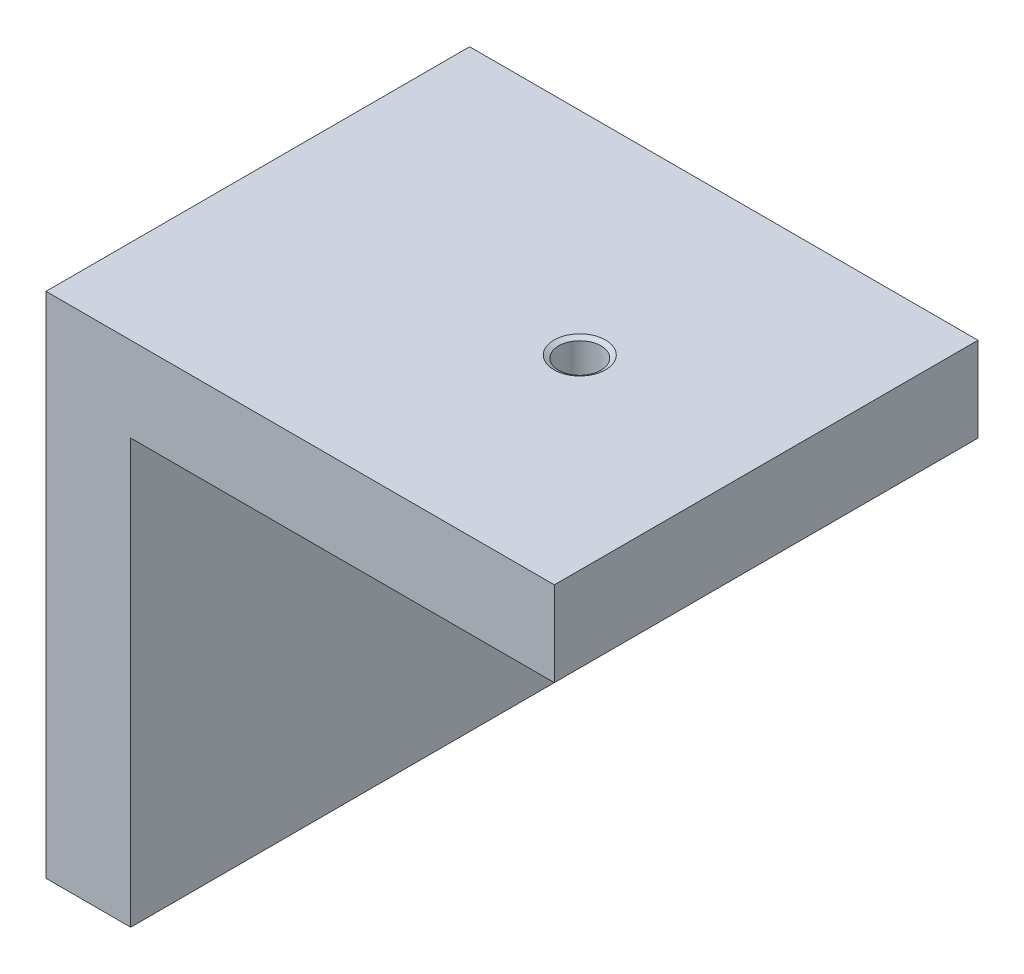
ISO-10303-21;
HEADER;
FILE_DESCRIPTION(('STEP AP214'),'2;1');
FILE_NAME('part.step','',(''),(''),'','','');
FILE_SCHEMA(('AUTOMOTIVE_DESIGN { 1 0 10303 214 1 1 1 1 }'));
ENDSEC;
DATA;
#1=APPLICATION_CONTEXT('core data for automotive mechanical design processes');
#2=APPLICATION_PROTOCOL_DEFINITION('international standard','automotive_design',2000,#1);
#3=PRODUCT_CONTEXT('',#1,'mechanical');
#4=PRODUCT('Part','Part','',(#3));
#5=PRODUCT_RELATED_PRODUCT_CATEGORY('part','',(#4));
#6=PRODUCT_DEFINITION_FORMATION('','',#4);
#7=PRODUCT_DEFINITION_CONTEXT('part definition',#1,'design');
#8=PRODUCT_DEFINITION('design','',#6,#7);
#9=PRODUCT_DEFINITION_SHAPE('','',#8);
#10=(LENGTH_UNIT() NAMED_UNIT(*) SI_UNIT(.MILLI.,.METRE.));
#11=(NAMED_UNIT(*) PLANE_ANGLE_UNIT() SI_UNIT($,.RADIAN.));
#12=(NAMED_UNIT(*) SI_UNIT($,.STERADIAN.) SOLID_ANGLE_UNIT());
#13=UNCERTAINTY_MEASURE_WITH_UNIT(LENGTH_MEASURE(1.E-05),#10,'distance_accuracy_value','');
#14=(GEOMETRIC_REPRESENTATION_CONTEXT(3) GLOBAL_UNCERTAINTY_ASSIGNED_CONTEXT((#13)) GLOBAL_UNIT_ASSIGNED_CONTEXT((#10,
#11,#12)) REPRESENTATION_CONTEXT('',''));
#15=CARTESIAN_POINT('',(0.,0.,0.));
#16=DIRECTION('',(0.,0.,1.));
#17=DIRECTION('',(1.,0.,0.));
#18=AXIS2_PLACEMENT_3D('',#15,#16,#17);
#19=CARTESIAN_POINT('',(5.,0.,25.));
#20=DIRECTION('',(0.,1.,0.));
#21=DIRECTION('',(-1.,0.,0.));
#22=AXIS2_PLACEMENT_3D('',#19,#20,#21);
#23=PLANE('',#22);
#24=DIRECTION('',(1.,0.,0.));
#25=VECTOR('',#24,1.);
#26=CARTESIAN_POINT('',(5.,0.,0.));
#27=LINE('',#26,#25);
#28=CARTESIAN_POINT('',(0.,0.,0.));
#29=VERTEX_POINT('',#28);
#30=CARTESIAN_POINT('',(5.,0.,0.));
#31=VERTEX_POINT('',#30);
#32=EDGE_CURVE('E120',#29,#31,#27,.T.);
#33=ORIENTED_EDGE('',*,*,#32,.T.);
#34=DIRECTION('',(0.,0.,-1.));
#35=VECTOR('',#34,1.);
#36=CARTESIAN_POINT('',(5.,0.,25.));
#37=LINE('',#36,#35);
#38=CARTESIAN_POINT('',(5.,0.,25.));
#39=VERTEX_POINT('',#38);
#40=EDGE_CURVE('E11',#39,#31,#37,.T.);
#41=ORIENTED_EDGE('',*,*,#40,.F.);
#42=DIRECTION('',(1.,0.,0.));
#43=VECTOR('',#42,1.);
#44=CARTESIAN_POINT('',(5.,0.,25.));
#45=LINE('',#44,#43);
#46=CARTESIAN_POINT('',(0.,0.,25.));
#47=VERTEX_POINT('',#46);
#48=EDGE_CURVE('E131',#47,#39,#45,.T.);
#49=ORIENTED_EDGE('',*,*,#48,.F.);
#50=DIRECTION('',(0.,0.,-1.));
#51=VECTOR('',#50,1.);
#52=CARTESIAN_POINT('',(0.,0.,25.));
#53=LINE('',#52,#51);
#54=EDGE_CURVE('E116',#47,#29,#53,.T.);
#55=ORIENTED_EDGE('',*,*,#54,.T.);
#56=EDGE_LOOP('',(#33,#41,#49,#55));
#57=FACE_BOUND('',#56,.T.);
#58=ADVANCED_FACE('F35',(#57),#23,.F.);
#59=CARTESIAN_POINT('',(5.,25.,25.));
#60=DIRECTION('',(-1.,0.,0.));
#61=DIRECTION('',(0.,-1.,0.));
#62=AXIS2_PLACEMENT_3D('',#59,#60,#61);
#63=PLANE('',#62);
#64=CARTESIAN_POINT('',(5.,18.,12.5));
#65=DIRECTION('',(-1.,0.,0.));
#66=DIRECTION('',(0.,-1.,0.));
#67=AXIS2_PLACEMENT_3D('',#64,#65,#66);
#68=CIRCLE('',#67,3.5);
#69=CARTESIAN_POINT('',(5.,14.5,12.5));
#70=VERTEX_POINT('',#69);
#71=EDGE_CURVE('E124',#70,#70,#68,.T.);
#72=ORIENTED_EDGE('',*,*,#71,.T.);
#73=EDGE_LOOP('',(#72));
#74=FACE_BOUND('',#73,.T.);
#75=DIRECTION('',(0.,1.,0.));
#76=VECTOR('',#75,1.);
#77=CARTESIAN_POINT('',(5.,25.,0.));
#78=LINE('',#77,#76);
#79=CARTESIAN_POINT('',(5.,25.,0.));
#80=VERTEX_POINT('',#79);
#81=EDGE_CURVE('E123',#31,#80,#78,.T.);
#82=ORIENTED_EDGE('',*,*,#81,.T.);
#83=DIRECTION('',(0.,0.,-1.));
#84=VECTOR('',#83,1.);
#85=CARTESIAN_POINT('',(5.,25.,25.));
#86=LINE('',#85,#84);
#87=CARTESIAN_POINT('',(5.,25.,25.));
#88=VERTEX_POINT('',#87);
#89=EDGE_CURVE('E44',#88,#80,#86,.T.);
#90=ORIENTED_EDGE('',*,*,#89,.F.);
#91=DIRECTION('',(0.,1.,0.));
#92=VECTOR('',#91,1.);
#93=CARTESIAN_POINT('',(5.,25.,25.));
#94=LINE('',#93,#92);
#95=EDGE_CURVE('E89',#39,#88,#94,.T.);
#96=ORIENTED_EDGE('',*,*,#95,.F.);
#97=ORIENTED_EDGE('',*,*,#40,.T.);
#98=EDGE_LOOP('',(#82,#90,#96,#97));
#99=FACE_BOUND('',#98,.T.);
#100=ADVANCED_FACE('F159',(#74,#99),#63,.F.);
#101=CARTESIAN_POINT('',(30.,25.,25.));
#102=DIRECTION('',(0.,1.,0.));
#103=DIRECTION('',(-1.,0.,0.));
#104=AXIS2_PLACEMENT_3D('',#101,#102,#103);
#105=PLANE('',#104);
#106=CARTESIAN_POINT('',(19.,25.,12.5));
#107=DIRECTION('',(0.,1.,0.));
#108=DIRECTION('',(-1.,0.,0.));
#109=AXIS2_PLACEMENT_3D('',#106,#107,#108);
#110=CIRCLE('',#109,1.24999999999999);
#111=CARTESIAN_POINT('',(17.75,25.,12.5));
#112=VERTEX_POINT('',#111);
#113=EDGE_CURVE('E38',#112,#112,#110,.T.);
#114=ORIENTED_EDGE('',*,*,#113,.T.);
#115=EDGE_LOOP('',(#114));
#116=FACE_BOUND('',#115,.T.);
#117=DIRECTION('',(1.,0.,0.));
#118=VECTOR('',#117,1.);
#119=CARTESIAN_POINT('',(30.,25.,0.));
#120=LINE('',#119,#118);
#121=CARTESIAN_POINT('',(30.,25.,0.));
#122=VERTEX_POINT('',#121);
#123=EDGE_CURVE('E126',#80,#122,#120,.T.);
#124=ORIENTED_EDGE('',*,*,#123,.T.);
#125=DIRECTION('',(0.,0.,-1.));
#126=VECTOR('',#125,1.);
#127=CARTESIAN_POINT('',(30.,25.,25.));
#128=LINE('',#127,#126);
#129=CARTESIAN_POINT('',(30.,25.,25.));
#130=VERTEX_POINT('',#129);
#131=EDGE_CURVE('E111',#130,#122,#128,.T.);
#132=ORIENTED_EDGE('',*,*,#131,.F.);
#133=DIRECTION('',(1.,0.,0.));
#134=VECTOR('',#133,1.);
#135=CARTESIAN_POINT('',(30.,25.,25.));
#136=LINE('',#135,#134);
#137=EDGE_CURVE('E102',#88,#130,#136,.T.);
#138=ORIENTED_EDGE('',*,*,#137,.F.);
#139=ORIENTED_EDGE('',*,*,#89,.T.);
#140=EDGE_LOOP('',(#124,#132,#138,#139));
#141=FACE_BOUND('',#140,.T.);
#142=ADVANCED_FACE('F138',(#116,#141),#105,.F.);
#143=CARTESIAN_POINT('',(30.,30.,25.));
#144=DIRECTION('',(-1.,0.,0.));
#145=DIRECTION('',(0.,0.,1.));
#146=AXIS2_PLACEMENT_3D('',#143,#144,#145);
#147=PLANE('',#146);
#148=DIRECTION('',(0.,1.,0.));
#149=VECTOR('',#148,1.);
#150=CARTESIAN_POINT('',(30.,30.,0.));
#151=LINE('',#150,#149);
#152=CARTESIAN_POINT('',(30.,30.,0.));
#153=VERTEX_POINT('',#152);
#154=EDGE_CURVE('E110',#122,#153,#151,.T.);
#155=ORIENTED_EDGE('',*,*,#154,.T.);
#156=DIRECTION('',(0.,0.,-1.));
#157=VECTOR('',#156,1.);
#158=CARTESIAN_POINT('',(30.,30.,25.));
#159=LINE('',#158,#157);
#160=CARTESIAN_POINT('',(30.,30.,25.));
#161=VERTEX_POINT('',#160);
#162=EDGE_CURVE('E107',#161,#153,#159,.T.);
#163=ORIENTED_EDGE('',*,*,#162,.F.);
#164=DIRECTION('',(0.,1.,0.));
#165=VECTOR('',#164,1.);
#166=CARTESIAN_POINT('',(30.,30.,25.));
#167=LINE('',#166,#165);
#168=EDGE_CURVE('E96',#130,#161,#167,.T.);
#169=ORIENTED_EDGE('',*,*,#168,.F.);
#170=ORIENTED_EDGE('',*,*,#131,.T.);
#171=EDGE_LOOP('',(#155,#163,#169,#170));
#172=FACE_BOUND('',#171,.T.);
#173=ADVANCED_FACE('F108',(#172),#147,.F.);
#174=CARTESIAN_POINT('',(0.,30.,25.));
#175=DIRECTION('',(0.,-1.,0.));
#176=DIRECTION('',(0.,0.,-1.));
#177=AXIS2_PLACEMENT_3D('',#174,#175,#176);
#178=PLANE('',#177);
#179=CARTESIAN_POINT('',(19.,30.,12.5));
#180=DIRECTION('',(0.,1.,0.));
#181=DIRECTION('',(0.,0.,1.));
#182=AXIS2_PLACEMENT_3D('',#179,#180,#181);
#183=CIRCLE('',#182,1.525);
#184=CARTESIAN_POINT('',(19.,30.,14.025));
#185=VERTEX_POINT('',#184);
#186=EDGE_CURVE('E259',#185,#185,#183,.T.);
#187=ORIENTED_EDGE('',*,*,#186,.F.);
#188=EDGE_LOOP('',(#187));
#189=FACE_BOUND('',#188,.T.);
#190=DIRECTION('',(-1.,0.,0.));
#191=VECTOR('',#190,1.);
#192=CARTESIAN_POINT('',(0.,30.,0.));
#193=LINE('',#192,#191);
#194=CARTESIAN_POINT('',(0.,30.,0.));
#195=VERTEX_POINT('',#194);
#196=EDGE_CURVE('E75',#153,#195,#193,.T.);
#197=ORIENTED_EDGE('',*,*,#196,.T.);
#198=DIRECTION('',(0.,0.,-1.));
#199=VECTOR('',#198,1.);
#200=CARTESIAN_POINT('',(0.,30.,25.));
#201=LINE('',#200,#199);
#202=CARTESIAN_POINT('',(0.,30.,25.));
#203=VERTEX_POINT('',#202);
#204=EDGE_CURVE('E112',#203,#195,#201,.T.);
#205=ORIENTED_EDGE('',*,*,#204,.F.);
#206=DIRECTION('',(-1.,0.,0.));
#207=VECTOR('',#206,1.);
#208=CARTESIAN_POINT('',(0.,30.,25.));
#209=LINE('',#208,#207);
#210=EDGE_CURVE('E100',#161,#203,#209,.T.);
#211=ORIENTED_EDGE('',*,*,#210,.F.);
#212=ORIENTED_EDGE('',*,*,#162,.T.);
#213=EDGE_LOOP('',(#197,#205,#211,#212));
#214=FACE_BOUND('',#213,.T.);
#215=ADVANCED_FACE('F114',(#189,#214),#178,.F.);
#216=CARTESIAN_POINT('',(0.,0.,25.));
#217=DIRECTION('',(1.,0.,0.));
#218=DIRECTION('',(0.,0.,-1.));
#219=AXIS2_PLACEMENT_3D('',#216,#217,#218);
#220=PLANE('',#219);
#221=CARTESIAN_POINT('',(0.,18.,12.5));
#222=DIRECTION('',(-1.,0.,0.));
#223=DIRECTION('',(0.,0.,1.));
#224=AXIS2_PLACEMENT_3D('',#221,#222,#223);
#225=CIRCLE('',#224,3.5);
#226=CARTESIAN_POINT('',(0.,18.,16.));
#227=VERTEX_POINT('',#226);
#228=EDGE_CURVE('E249',#227,#227,#225,.T.);
#229=ORIENTED_EDGE('',*,*,#228,.F.);
#230=EDGE_LOOP('',(#229));
#231=FACE_BOUND('',#230,.T.);
#232=DIRECTION('',(0.,-1.,0.));
#233=VECTOR('',#232,1.);
#234=CARTESIAN_POINT('',(0.,0.,0.));
#235=LINE('',#234,#233);
#236=EDGE_CURVE('E81',#195,#29,#235,.T.);
#237=ORIENTED_EDGE('',*,*,#236,.T.);
#238=ORIENTED_EDGE('',*,*,#54,.F.);
#239=DIRECTION('',(0.,-1.,0.));
#240=VECTOR('',#239,1.);
#241=CARTESIAN_POINT('',(0.,0.,25.));
#242=LINE('',#241,#240);
#243=EDGE_CURVE('E52',#203,#47,#242,.T.);
#244=ORIENTED_EDGE('',*,*,#243,.F.);
#245=ORIENTED_EDGE('',*,*,#204,.T.);
#246=EDGE_LOOP('',(#237,#238,#244,#245));
#247=FACE_BOUND('',#246,.T.);
#248=ADVANCED_FACE('F145',(#231,#247),#220,.F.);
#249=CARTESIAN_POINT('',(0.,0.,25.));
#250=DIRECTION('',(0.,0.,-1.));
#251=DIRECTION('',(-1.,0.,0.));
#252=AXIS2_PLACEMENT_3D('',#249,#250,#251);
#253=PLANE('',#252);
#254=ORIENTED_EDGE('',*,*,#48,.T.);
#255=ORIENTED_EDGE('',*,*,#95,.T.);
#256=ORIENTED_EDGE('',*,*,#137,.T.);
#257=ORIENTED_EDGE('',*,*,#168,.T.);
#258=ORIENTED_EDGE('',*,*,#210,.T.);
#259=ORIENTED_EDGE('',*,*,#243,.T.);
#260=EDGE_LOOP('',(#254,#255,#256,#257,#258,#259));
#261=FACE_BOUND('',#260,.T.);
#262=ADVANCED_FACE('F98',(#261),#253,.F.);
#263=CARTESIAN_POINT('',(0.,0.,0.));
#264=DIRECTION('',(0.,0.,-1.));
#265=DIRECTION('',(-1.,0.,0.));
#266=AXIS2_PLACEMENT_3D('',#263,#264,#265);
#267=PLANE('',#266);
#268=ORIENTED_EDGE('',*,*,#32,.F.);
#269=ORIENTED_EDGE('',*,*,#236,.F.);
#270=ORIENTED_EDGE('',*,*,#196,.F.);
#271=ORIENTED_EDGE('',*,*,#154,.F.);
#272=ORIENTED_EDGE('',*,*,#123,.F.);
#273=ORIENTED_EDGE('',*,*,#81,.F.);
#274=EDGE_LOOP('',(#268,#269,#270,#271,#272,#273));
#275=FACE_BOUND('',#274,.T.);
#276=ADVANCED_FACE('F141',(#275),#267,.T.);
#277=CARTESIAN_POINT('',(25.,18.,12.5));
#278=DIRECTION('',(-1.,0.,0.));
#279=DIRECTION('',(0.,0.,1.));
#280=AXIS2_PLACEMENT_3D('',#277,#278,#279);
#281=CYLINDRICAL_SURFACE('',#280,3.5);
#282=ORIENTED_EDGE('',*,*,#228,.T.);
#283=EDGE_LOOP('',(#282));
#284=FACE_BOUND('',#283,.T.);
#285=ORIENTED_EDGE('',*,*,#71,.F.);
#286=EDGE_LOOP('',(#285));
#287=FACE_BOUND('',#286,.T.);
#288=ADVANCED_FACE('F197',(#284,#287),#281,.F.);
#289=CARTESIAN_POINT('',(19.,30.,12.5));
#290=DIRECTION('',(0.,1.,0.));
#291=DIRECTION('',(0.,0.,1.));
#292=AXIS2_PLACEMENT_3D('',#289,#290,#291);
#293=CYLINDRICAL_SURFACE('',#292,1.24999999999999);
#294=CARTESIAN_POINT('',(19.,29.8412286759729,12.5));
#295=DIRECTION('',(0.,1.,0.));
#296=DIRECTION('',(0.,0.,1.));
#297=AXIS2_PLACEMENT_3D('',#294,#295,#296);
#298=CIRCLE('',#297,1.25);
#299=CARTESIAN_POINT('',(19.,29.8412286759729,13.75));
#300=VERTEX_POINT('',#299);
#301=EDGE_CURVE('E256',#300,#300,#298,.T.);
#302=ORIENTED_EDGE('',*,*,#301,.T.);
#303=EDGE_LOOP('',(#302));
#304=FACE_BOUND('',#303,.T.);
#305=ORIENTED_EDGE('',*,*,#113,.F.);
#306=EDGE_LOOP('',(#305));
#307=FACE_BOUND('',#306,.T.);
#308=ADVANCED_FACE('F190',(#304,#307),#293,.F.);
#309=CARTESIAN_POINT('',(19.,30.,12.5));
#310=DIRECTION('',(0.,1.,0.));
#311=DIRECTION('',(0.,0.,1.));
#312=AXIS2_PLACEMENT_3D('',#309,#310,#311);
#313=CONICAL_SURFACE('',#312,1.525,1.0471975511966);
#314=ORIENTED_EDGE('',*,*,#301,.F.);
#315=EDGE_LOOP('',(#314));
#316=FACE_BOUND('',#315,.T.);
#317=ORIENTED_EDGE('',*,*,#186,.T.);
#318=EDGE_LOOP('',(#317));
#319=FACE_BOUND('',#318,.T.);
#320=ADVANCED_FACE('F196',(#316,#319),#313,.F.);
#321=CLOSED_SHELL('',(#58,#100,#142,#173,#215,#248,#262,#276,#288,#308,#320));
#322=MANIFOLD_SOLID_BREP('B2',#321);
#323=ADVANCED_BREP_SHAPE_REPRESENTATION('',(#18,#322),#14);
#324=SHAPE_DEFINITION_REPRESENTATION(#9,#323);
ENDSEC;
END-ISO-10303-21;
